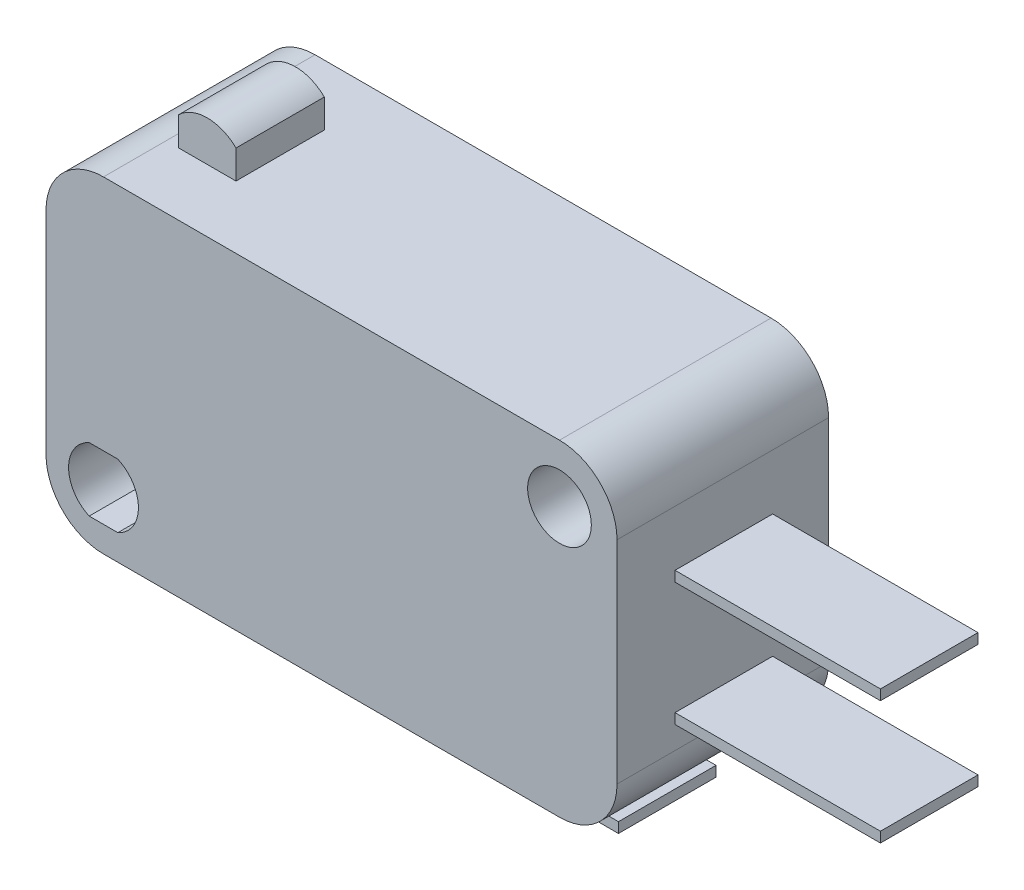
ISO-10303-21;
HEADER;
FILE_DESCRIPTION(('STEP AP214'),'2;1');
FILE_NAME('part.step','',(''),(''),'','','');
FILE_SCHEMA(('AUTOMOTIVE_DESIGN { 1 0 10303 214 1 1 1 1 }'));
ENDSEC;
DATA;
#1=APPLICATION_CONTEXT('core data for automotive mechanical design processes');
#2=APPLICATION_PROTOCOL_DEFINITION('international standard','automotive_design',2000,#1);
#3=PRODUCT_CONTEXT('',#1,'mechanical');
#4=PRODUCT('Part','Part','',(#3));
#5=PRODUCT_RELATED_PRODUCT_CATEGORY('part','',(#4));
#6=PRODUCT_DEFINITION_FORMATION('','',#4);
#7=PRODUCT_DEFINITION_CONTEXT('part definition',#1,'design');
#8=PRODUCT_DEFINITION('design','',#6,#7);
#9=PRODUCT_DEFINITION_SHAPE('','',#8);
#10=(LENGTH_UNIT() NAMED_UNIT(*) SI_UNIT(.MILLI.,.METRE.));
#11=(NAMED_UNIT(*) PLANE_ANGLE_UNIT() SI_UNIT($,.RADIAN.));
#12=(NAMED_UNIT(*) SI_UNIT($,.STERADIAN.) SOLID_ANGLE_UNIT());
#13=UNCERTAINTY_MEASURE_WITH_UNIT(LENGTH_MEASURE(1.E-05),#10,'distance_accuracy_value','');
#14=(GEOMETRIC_REPRESENTATION_CONTEXT(3) GLOBAL_UNCERTAINTY_ASSIGNED_CONTEXT((#13)) GLOBAL_UNIT_ASSIGNED_CONTEXT((#10,
#11,#12)) REPRESENTATION_CONTEXT('',''));
#15=CARTESIAN_POINT('',(0.,0.,0.));
#16=DIRECTION('',(0.,0.,1.));
#17=DIRECTION('',(1.,0.,0.));
#18=AXIS2_PLACEMENT_3D('',#15,#16,#17);
#19=CARTESIAN_POINT('',(-25.,2.8,5.15));
#20=DIRECTION('',(0.,-1.,0.));
#21=DIRECTION('',(0.,0.,-1.));
#22=AXIS2_PLACEMENT_3D('',#19,#20,#21);
#23=PLANE('',#22);
#24=DIRECTION('',(-1.,0.,0.));
#25=VECTOR('',#24,1.);
#26=CARTESIAN_POINT('',(-25.,2.8,-5.15));
#27=LINE('',#26,#25);
#28=CARTESIAN_POINT('',(0.,2.8,-5.15));
#29=VERTEX_POINT('',#28);
#30=CARTESIAN_POINT('',(-22.2,2.8,-5.15));
#31=VERTEX_POINT('',#30);
#32=EDGE_CURVE('E407',#29,#31,#27,.T.);
#33=ORIENTED_EDGE('',*,*,#32,.T.);
#34=DIRECTION('',(0.,0.,-1.));
#35=VECTOR('',#34,1.);
#36=CARTESIAN_POINT('',(-22.2,2.8,5.15));
#37=LINE('',#36,#35);
#38=CARTESIAN_POINT('',(-22.2,2.8,5.15));
#39=VERTEX_POINT('',#38);
#40=EDGE_CURVE('E437',#31,#39,#37,.F.);
#41=ORIENTED_EDGE('',*,*,#40,.T.);
#42=DIRECTION('',(-1.,0.,0.));
#43=VECTOR('',#42,1.);
#44=CARTESIAN_POINT('',(-25.,2.8,5.15));
#45=LINE('',#44,#43);
#46=CARTESIAN_POINT('',(0.,2.8,5.15));
#47=VERTEX_POINT('',#46);
#48=EDGE_CURVE('E418',#47,#39,#45,.T.);
#49=ORIENTED_EDGE('',*,*,#48,.F.);
#50=DIRECTION('',(0.,0.,-1.));
#51=VECTOR('',#50,1.);
#52=CARTESIAN_POINT('',(0.,2.8,5.15));
#53=LINE('',#52,#51);
#54=EDGE_CURVE('E434',#47,#29,#53,.T.);
#55=ORIENTED_EDGE('',*,*,#54,.T.);
#56=EDGE_LOOP('',(#33,#41,#49,#55));
#57=FACE_BOUND('',#56,.T.);
#58=DIRECTION('',(-1.,0.,0.));
#59=VECTOR('',#58,1.);
#60=CARTESIAN_POINT('',(-21.6,2.8,-2.2));
#61=LINE('',#60,#59);
#62=CARTESIAN_POINT('',(-18.8,2.8,-2.2));
#63=VERTEX_POINT('',#62);
#64=CARTESIAN_POINT('',(-21.6,2.8,-2.2));
#65=VERTEX_POINT('',#64);
#66=EDGE_CURVE('E245',#63,#65,#61,.T.);
#67=ORIENTED_EDGE('',*,*,#66,.F.);
#68=DIRECTION('',(0.,0.,1.));
#69=VECTOR('',#68,1.);
#70=CARTESIAN_POINT('',(-18.8,2.8,-2.2));
#71=LINE('',#70,#69);
#72=CARTESIAN_POINT('',(-18.8,2.8,2.1));
#73=VERTEX_POINT('',#72);
#74=EDGE_CURVE('E232',#63,#73,#71,.T.);
#75=ORIENTED_EDGE('',*,*,#74,.T.);
#76=DIRECTION('',(-1.,0.,0.));
#77=VECTOR('',#76,1.);
#78=CARTESIAN_POINT('',(-21.6,2.8,2.1));
#79=LINE('',#78,#77);
#80=CARTESIAN_POINT('',(-21.6,2.8,2.1));
#81=VERTEX_POINT('',#80);
#82=EDGE_CURVE('E219',#73,#81,#79,.T.);
#83=ORIENTED_EDGE('',*,*,#82,.T.);
#84=DIRECTION('',(0.,0.,1.));
#85=VECTOR('',#84,1.);
#86=CARTESIAN_POINT('',(-21.6,2.8,-2.2));
#87=LINE('',#86,#85);
#88=EDGE_CURVE('E250',#65,#81,#87,.T.);
#89=ORIENTED_EDGE('',*,*,#88,.F.);
#90=EDGE_LOOP('',(#67,#75,#83,#89));
#91=FACE_BOUND('',#90,.T.);
#92=ADVANCED_FACE('F17',(#57,#91),#23,.F.);
#93=CARTESIAN_POINT('',(-25.,-13.1,5.15));
#94=DIRECTION('',(0.,1.,0.));
#95=DIRECTION('',(-1.,0.,0.));
#96=AXIS2_PLACEMENT_3D('',#93,#94,#95);
#97=PLANE('',#96);
#98=DIRECTION('',(1.,0.,0.));
#99=VECTOR('',#98,1.);
#100=CARTESIAN_POINT('',(-25.,-13.1,5.15));
#101=LINE('',#100,#99);
#102=CARTESIAN_POINT('',(-22.2,-13.1,5.15));
#103=VERTEX_POINT('',#102);
#104=CARTESIAN_POINT('',(0.,-13.1,5.15));
#105=VERTEX_POINT('',#104);
#106=EDGE_CURVE('E413',#103,#105,#101,.T.);
#107=ORIENTED_EDGE('',*,*,#106,.F.);
#108=DIRECTION('',(0.,0.,-1.));
#109=VECTOR('',#108,1.);
#110=CARTESIAN_POINT('',(-22.2,-13.1,5.15));
#111=LINE('',#110,#109);
#112=CARTESIAN_POINT('',(-22.2,-13.1,-5.15));
#113=VERTEX_POINT('',#112);
#114=EDGE_CURVE('E449',#103,#113,#111,.T.);
#115=ORIENTED_EDGE('',*,*,#114,.T.);
#116=DIRECTION('',(1.,0.,0.));
#117=VECTOR('',#116,1.);
#118=CARTESIAN_POINT('',(-25.,-13.1,-5.15));
#119=LINE('',#118,#117);
#120=CARTESIAN_POINT('',(0.,-13.1,-5.15));
#121=VERTEX_POINT('',#120);
#122=EDGE_CURVE('E402',#113,#121,#119,.T.);
#123=ORIENTED_EDGE('',*,*,#122,.T.);
#124=DIRECTION('',(0.,0.,-1.));
#125=VECTOR('',#124,1.);
#126=CARTESIAN_POINT('',(0.,-13.1,5.15));
#127=LINE('',#126,#125);
#128=EDGE_CURVE('E447',#121,#105,#127,.F.);
#129=ORIENTED_EDGE('',*,*,#128,.T.);
#130=EDGE_LOOP('',(#107,#115,#123,#129));
#131=FACE_BOUND('',#130,.T.);
#132=DIRECTION('',(-1.,0.,0.));
#133=VECTOR('',#132,1.);
#134=CARTESIAN_POINT('',(-9.98,-13.1,1.5));
#135=LINE('',#134,#133);
#136=CARTESIAN_POINT('',(-9.48,-13.1,1.5));
#137=VERTEX_POINT('',#136);
#138=CARTESIAN_POINT('',(-9.98,-13.1,1.5));
#139=VERTEX_POINT('',#138);
#140=EDGE_CURVE('E303',#137,#139,#135,.T.);
#141=ORIENTED_EDGE('',*,*,#140,.F.);
#142=DIRECTION('',(0.,0.,-1.));
#143=VECTOR('',#142,1.);
#144=CARTESIAN_POINT('',(-9.48,-13.1,1.5));
#145=LINE('',#144,#143);
#146=CARTESIAN_POINT('',(-9.48,-13.1,-3.25));
#147=VERTEX_POINT('',#146);
#148=EDGE_CURVE('E316',#137,#147,#145,.T.);
#149=ORIENTED_EDGE('',*,*,#148,.T.);
#150=DIRECTION('',(-1.,0.,0.));
#151=VECTOR('',#150,1.);
#152=CARTESIAN_POINT('',(-9.98,-13.1,-3.25));
#153=LINE('',#152,#151);
#154=CARTESIAN_POINT('',(-9.98,-13.1,-3.25));
#155=VERTEX_POINT('',#154);
#156=EDGE_CURVE('E290',#147,#155,#153,.T.);
#157=ORIENTED_EDGE('',*,*,#156,.T.);
#158=DIRECTION('',(0.,0.,-1.));
#159=VECTOR('',#158,1.);
#160=CARTESIAN_POINT('',(-9.98,-13.1,1.5));
#161=LINE('',#160,#159);
#162=EDGE_CURVE('E331',#139,#155,#161,.T.);
#163=ORIENTED_EDGE('',*,*,#162,.F.);
#164=EDGE_LOOP('',(#141,#149,#157,#163));
#165=FACE_BOUND('',#164,.T.);
#166=ADVANCED_FACE('F455',(#131,#165),#97,.F.);
#167=CARTESIAN_POINT('',(2.8,2.8,5.15));
#168=DIRECTION('',(-1.,0.,0.));
#169=DIRECTION('',(0.,-1.,0.));
#170=AXIS2_PLACEMENT_3D('',#167,#168,#169);
#171=PLANE('',#170);
#172=DIRECTION('',(0.,-1.,0.));
#173=VECTOR('',#172,1.);
#174=CARTESIAN_POINT('',(2.8,-2.7,2.325));
#175=LINE('',#174,#173);
#176=CARTESIAN_POINT('',(2.8,-2.7,2.325));
#177=VERTEX_POINT('',#176);
#178=CARTESIAN_POINT('',(2.8,-3.2,2.325));
#179=VERTEX_POINT('',#178);
#180=EDGE_CURVE('E366',#177,#179,#175,.T.);
#181=ORIENTED_EDGE('',*,*,#180,.F.);
#182=DIRECTION('',(0.,0.,1.));
#183=VECTOR('',#182,1.);
#184=CARTESIAN_POINT('',(2.8,-2.7,2.325));
#185=LINE('',#184,#183);
#186=CARTESIAN_POINT('',(2.8,-2.7,-2.425));
#187=VERTEX_POINT('',#186);
#188=EDGE_CURVE('E375',#187,#177,#185,.T.);
#189=ORIENTED_EDGE('',*,*,#188,.F.);
#190=DIRECTION('',(0.,1.,0.));
#191=VECTOR('',#190,1.);
#192=CARTESIAN_POINT('',(2.8,-2.7,-2.425));
#193=LINE('',#192,#191);
#194=CARTESIAN_POINT('',(2.8,-3.2,-2.425));
#195=VERTEX_POINT('',#194);
#196=EDGE_CURVE('E372',#195,#187,#193,.T.);
#197=ORIENTED_EDGE('',*,*,#196,.F.);
#198=DIRECTION('',(0.,0.,-1.));
#199=VECTOR('',#198,1.);
#200=CARTESIAN_POINT('',(2.8,-3.2,2.325));
#201=LINE('',#200,#199);
#202=EDGE_CURVE('E369',#179,#195,#201,.T.);
#203=ORIENTED_EDGE('',*,*,#202,.F.);
#204=EDGE_LOOP('',(#181,#189,#197,#203));
#205=FACE_BOUND('',#204,.T.);
#206=DIRECTION('',(0.,1.,0.));
#207=VECTOR('',#206,1.);
#208=CARTESIAN_POINT('',(2.8,2.8,5.15));
#209=LINE('',#208,#207);
#210=CARTESIAN_POINT('',(2.8,-10.3,5.15));
#211=VERTEX_POINT('',#210);
#212=CARTESIAN_POINT('',(2.8,0.,5.15));
#213=VERTEX_POINT('',#212);
#214=EDGE_CURVE('E416',#211,#213,#209,.T.);
#215=ORIENTED_EDGE('',*,*,#214,.F.);
#216=DIRECTION('',(0.,0.,-1.));
#217=VECTOR('',#216,1.);
#218=CARTESIAN_POINT('',(2.8,-10.3,5.15));
#219=LINE('',#218,#217);
#220=CARTESIAN_POINT('',(2.8,-10.3,-5.15));
#221=VERTEX_POINT('',#220);
#222=EDGE_CURVE('E11',#211,#221,#219,.T.);
#223=ORIENTED_EDGE('',*,*,#222,.T.);
#224=DIRECTION('',(0.,1.,0.));
#225=VECTOR('',#224,1.);
#226=CARTESIAN_POINT('',(2.8,2.8,-5.15));
#227=LINE('',#226,#225);
#228=CARTESIAN_POINT('',(2.8,0.,-5.15));
#229=VERTEX_POINT('',#228);
#230=EDGE_CURVE('E405',#221,#229,#227,.T.);
#231=ORIENTED_EDGE('',*,*,#230,.T.);
#232=DIRECTION('',(0.,0.,-1.));
#233=VECTOR('',#232,1.);
#234=CARTESIAN_POINT('',(2.8,0.,5.15));
#235=LINE('',#234,#233);
#236=EDGE_CURVE('E25',#229,#213,#235,.F.);
#237=ORIENTED_EDGE('',*,*,#236,.T.);
#238=EDGE_LOOP('',(#215,#223,#231,#237));
#239=FACE_BOUND('',#238,.T.);
#240=DIRECTION('',(0.,-1.,0.));
#241=VECTOR('',#240,1.);
#242=CARTESIAN_POINT('',(2.8,-8.7,2.325));
#243=LINE('',#242,#241);
#244=CARTESIAN_POINT('',(2.8,-8.7,2.325));
#245=VERTEX_POINT('',#244);
#246=CARTESIAN_POINT('',(2.8,-9.2,2.325));
#247=VERTEX_POINT('',#246);
#248=EDGE_CURVE('E333',#245,#247,#243,.T.);
#249=ORIENTED_EDGE('',*,*,#248,.F.);
#250=DIRECTION('',(0.,0.,1.));
#251=VECTOR('',#250,1.);
#252=CARTESIAN_POINT('',(2.8,-8.7,2.325));
#253=LINE('',#252,#251);
#254=CARTESIAN_POINT('',(2.8,-8.7,-2.425));
#255=VERTEX_POINT('',#254);
#256=EDGE_CURVE('E342',#255,#245,#253,.T.);
#257=ORIENTED_EDGE('',*,*,#256,.F.);
#258=DIRECTION('',(0.,1.,0.));
#259=VECTOR('',#258,1.);
#260=CARTESIAN_POINT('',(2.8,-8.7,-2.425));
#261=LINE('',#260,#259);
#262=CARTESIAN_POINT('',(2.8,-9.2,-2.425));
#263=VERTEX_POINT('',#262);
#264=EDGE_CURVE('E339',#263,#255,#261,.T.);
#265=ORIENTED_EDGE('',*,*,#264,.F.);
#266=DIRECTION('',(0.,0.,-1.));
#267=VECTOR('',#266,1.);
#268=CARTESIAN_POINT('',(2.8,-9.2,2.325));
#269=LINE('',#268,#267);
#270=EDGE_CURVE('E336',#247,#263,#269,.T.);
#271=ORIENTED_EDGE('',*,*,#270,.F.);
#272=EDGE_LOOP('',(#249,#257,#265,#271));
#273=FACE_BOUND('',#272,.T.);
#274=ADVANCED_FACE('F468',(#205,#239,#273),#171,.F.);
#275=CARTESIAN_POINT('',(-25.,2.8,5.15));
#276=DIRECTION('',(1.,0.,0.));
#277=DIRECTION('',(0.,1.,0.));
#278=AXIS2_PLACEMENT_3D('',#275,#276,#277);
#279=PLANE('',#278);
#280=DIRECTION('',(0.,-1.,0.));
#281=VECTOR('',#280,1.);
#282=CARTESIAN_POINT('',(-25.,2.8,5.15));
#283=LINE('',#282,#281);
#284=CARTESIAN_POINT('',(-25.,0.,5.15));
#285=VERTEX_POINT('',#284);
#286=CARTESIAN_POINT('',(-25.,-10.3,5.15));
#287=VERTEX_POINT('',#286);
#288=EDGE_CURVE('E410',#285,#287,#283,.T.);
#289=ORIENTED_EDGE('',*,*,#288,.F.);
#290=DIRECTION('',(0.,0.,-1.));
#291=VECTOR('',#290,1.);
#292=CARTESIAN_POINT('',(-25.,0.,5.15));
#293=LINE('',#292,#291);
#294=CARTESIAN_POINT('',(-25.,0.,-5.15));
#295=VERTEX_POINT('',#294);
#296=EDGE_CURVE('E423',#285,#295,#293,.T.);
#297=ORIENTED_EDGE('',*,*,#296,.T.);
#298=DIRECTION('',(0.,-1.,0.));
#299=VECTOR('',#298,1.);
#300=CARTESIAN_POINT('',(-25.,2.8,-5.15));
#301=LINE('',#300,#299);
#302=CARTESIAN_POINT('',(-25.,-10.3,-5.15));
#303=VERTEX_POINT('',#302);
#304=EDGE_CURVE('E399',#295,#303,#301,.T.);
#305=ORIENTED_EDGE('',*,*,#304,.T.);
#306=DIRECTION('',(0.,0.,-1.));
#307=VECTOR('',#306,1.);
#308=CARTESIAN_POINT('',(-25.,-10.3,5.15));
#309=LINE('',#308,#307);
#310=EDGE_CURVE('E421',#303,#287,#309,.F.);
#311=ORIENTED_EDGE('',*,*,#310,.T.);
#312=EDGE_LOOP('',(#289,#297,#305,#311));
#313=FACE_BOUND('',#312,.T.);
#314=ADVANCED_FACE('F19',(#313),#279,.F.);
#315=CARTESIAN_POINT('',(-25.,2.8,5.15));
#316=DIRECTION('',(0.,0.,1.));
#317=DIRECTION('',(1.,0.,0.));
#318=AXIS2_PLACEMENT_3D('',#315,#316,#317);
#319=PLANE('',#318);
#320=CARTESIAN_POINT('',(-22.2,-10.3,5.15));
#321=DIRECTION('',(0.,0.,1.));
#322=DIRECTION('',(1.,0.,0.));
#323=AXIS2_PLACEMENT_3D('',#320,#321,#322);
#324=CIRCLE('',#323,1.7);
#325=CARTESIAN_POINT('',(-22.8982120021885,-8.75,5.15));
#326=VERTEX_POINT('',#325);
#327=CARTESIAN_POINT('',(-22.8982120021884,-11.85,5.15));
#328=VERTEX_POINT('',#327);
#329=EDGE_CURVE('E231',#326,#328,#324,.T.);
#330=ORIENTED_EDGE('',*,*,#329,.F.);
#331=DIRECTION('',(-1.,0.,0.));
#332=VECTOR('',#331,1.);
#333=CARTESIAN_POINT('',(-22.8982120021885,-8.75,5.15));
#334=LINE('',#333,#332);
#335=CARTESIAN_POINT('',(-21.5017879978115,-8.75,5.15));
#336=VERTEX_POINT('',#335);
#337=EDGE_CURVE('E260',#336,#326,#334,.T.);
#338=ORIENTED_EDGE('',*,*,#337,.F.);
#339=CARTESIAN_POINT('',(-22.2,-10.3,5.15));
#340=DIRECTION('',(0.,0.,1.));
#341=DIRECTION('',(1.,0.,0.));
#342=AXIS2_PLACEMENT_3D('',#339,#340,#341);
#343=CIRCLE('',#342,1.7);
#344=CARTESIAN_POINT('',(-21.5017879978116,-11.85,5.15));
#345=VERTEX_POINT('',#344);
#346=EDGE_CURVE('E257',#345,#336,#343,.T.);
#347=ORIENTED_EDGE('',*,*,#346,.F.);
#348=DIRECTION('',(1.,0.,0.));
#349=VECTOR('',#348,1.);
#350=CARTESIAN_POINT('',(-22.8982120021884,-11.85,5.15));
#351=LINE('',#350,#349);
#352=EDGE_CURVE('E254',#328,#345,#351,.T.);
#353=ORIENTED_EDGE('',*,*,#352,.F.);
#354=EDGE_LOOP('',(#330,#338,#347,#353));
#355=FACE_BOUND('',#354,.T.);
#356=CARTESIAN_POINT('',(0.,0.,5.15));
#357=DIRECTION('',(0.,0.,1.));
#358=DIRECTION('',(1.,0.,0.));
#359=AXIS2_PLACEMENT_3D('',#356,#357,#358);
#360=CIRCLE('',#359,1.55);
#361=CARTESIAN_POINT('',(1.55,0.,5.15));
#362=VERTEX_POINT('',#361);
#363=EDGE_CURVE('E278',#362,#362,#360,.T.);
#364=ORIENTED_EDGE('',*,*,#363,.F.);
#365=EDGE_LOOP('',(#364));
#366=FACE_BOUND('',#365,.T.);
#367=ORIENTED_EDGE('',*,*,#48,.T.);
#368=CARTESIAN_POINT('',(-22.2,0.,5.15));
#369=DIRECTION('',(0.,0.,1.));
#370=DIRECTION('',(1.,0.,0.));
#371=AXIS2_PLACEMENT_3D('',#368,#369,#370);
#372=CIRCLE('',#371,2.8);
#373=EDGE_CURVE('E445',#39,#285,#372,.T.);
#374=ORIENTED_EDGE('',*,*,#373,.T.);
#375=ORIENTED_EDGE('',*,*,#288,.T.);
#376=CARTESIAN_POINT('',(-22.2,-10.3,5.15));
#377=DIRECTION('',(0.,0.,1.));
#378=DIRECTION('',(1.,0.,0.));
#379=AXIS2_PLACEMENT_3D('',#376,#377,#378);
#380=CIRCLE('',#379,2.8);
#381=EDGE_CURVE('E443',#287,#103,#380,.T.);
#382=ORIENTED_EDGE('',*,*,#381,.T.);
#383=ORIENTED_EDGE('',*,*,#106,.T.);
#384=CARTESIAN_POINT('',(0.,-10.3,5.15));
#385=DIRECTION('',(0.,0.,1.));
#386=DIRECTION('',(1.,0.,0.));
#387=AXIS2_PLACEMENT_3D('',#384,#385,#386);
#388=CIRCLE('',#387,2.8);
#389=EDGE_CURVE('E441',#105,#211,#388,.T.);
#390=ORIENTED_EDGE('',*,*,#389,.T.);
#391=ORIENTED_EDGE('',*,*,#214,.T.);
#392=CARTESIAN_POINT('',(0.,0.,5.15));
#393=DIRECTION('',(0.,0.,1.));
#394=DIRECTION('',(1.,0.,0.));
#395=AXIS2_PLACEMENT_3D('',#392,#393,#394);
#396=CIRCLE('',#395,2.8);
#397=EDGE_CURVE('E439',#213,#47,#396,.T.);
#398=ORIENTED_EDGE('',*,*,#397,.T.);
#399=EDGE_LOOP('',(#367,#374,#375,#382,#383,#390,#391,#398));
#400=FACE_BOUND('',#399,.T.);
#401=ADVANCED_FACE('F472',(#355,#366,#400),#319,.T.);
#402=CARTESIAN_POINT('',(-25.,2.8,-5.15));
#403=DIRECTION('',(0.,0.,1.));
#404=DIRECTION('',(1.,0.,0.));
#405=AXIS2_PLACEMENT_3D('',#402,#403,#404);
#406=PLANE('',#405);
#407=DIRECTION('',(-1.,0.,0.));
#408=VECTOR('',#407,1.);
#409=CARTESIAN_POINT('',(-22.8982120021885,-8.75,-5.15));
#410=LINE('',#409,#408);
#411=CARTESIAN_POINT('',(-21.5017879978115,-8.75,-5.15));
#412=VERTEX_POINT('',#411);
#413=CARTESIAN_POINT('',(-22.8982120021885,-8.75,-5.15));
#414=VERTEX_POINT('',#413);
#415=EDGE_CURVE('E272',#412,#414,#410,.T.);
#416=ORIENTED_EDGE('',*,*,#415,.T.);
#417=CARTESIAN_POINT('',(-22.2,-10.3,-5.15));
#418=DIRECTION('',(0.,0.,1.));
#419=DIRECTION('',(1.,0.,0.));
#420=AXIS2_PLACEMENT_3D('',#417,#418,#419);
#421=CIRCLE('',#420,1.7);
#422=CARTESIAN_POINT('',(-22.8982120021884,-11.85,-5.15));
#423=VERTEX_POINT('',#422);
#424=EDGE_CURVE('E263',#414,#423,#421,.T.);
#425=ORIENTED_EDGE('',*,*,#424,.T.);
#426=DIRECTION('',(1.,0.,0.));
#427=VECTOR('',#426,1.);
#428=CARTESIAN_POINT('',(-22.8982120021884,-11.85,-5.15));
#429=LINE('',#428,#427);
#430=CARTESIAN_POINT('',(-21.5017879978116,-11.85,-5.15));
#431=VERTEX_POINT('',#430);
#432=EDGE_CURVE('E266',#423,#431,#429,.T.);
#433=ORIENTED_EDGE('',*,*,#432,.T.);
#434=CARTESIAN_POINT('',(-22.2,-10.3,-5.15));
#435=DIRECTION('',(0.,0.,1.));
#436=DIRECTION('',(1.,0.,0.));
#437=AXIS2_PLACEMENT_3D('',#434,#435,#436);
#438=CIRCLE('',#437,1.7);
#439=EDGE_CURVE('E269',#431,#412,#438,.T.);
#440=ORIENTED_EDGE('',*,*,#439,.T.);
#441=EDGE_LOOP('',(#416,#425,#433,#440));
#442=FACE_BOUND('',#441,.T.);
#443=CARTESIAN_POINT('',(0.,0.,-5.15));
#444=DIRECTION('',(0.,0.,1.));
#445=DIRECTION('',(1.,0.,0.));
#446=AXIS2_PLACEMENT_3D('',#443,#444,#445);
#447=CIRCLE('',#446,1.55);
#448=CARTESIAN_POINT('',(1.55,0.,-5.15));
#449=VERTEX_POINT('',#448);
#450=EDGE_CURVE('E287',#449,#449,#447,.T.);
#451=ORIENTED_EDGE('',*,*,#450,.T.);
#452=EDGE_LOOP('',(#451));
#453=FACE_BOUND('',#452,.T.);
#454=ORIENTED_EDGE('',*,*,#304,.F.);
#455=CARTESIAN_POINT('',(-22.2,0.,-5.15));
#456=DIRECTION('',(0.,0.,1.));
#457=DIRECTION('',(1.,0.,0.));
#458=AXIS2_PLACEMENT_3D('',#455,#456,#457);
#459=CIRCLE('',#458,2.8);
#460=EDGE_CURVE('E432',#295,#31,#459,.F.);
#461=ORIENTED_EDGE('',*,*,#460,.T.);
#462=ORIENTED_EDGE('',*,*,#32,.F.);
#463=CARTESIAN_POINT('',(0.,0.,-5.15));
#464=DIRECTION('',(0.,0.,1.));
#465=DIRECTION('',(1.,0.,0.));
#466=AXIS2_PLACEMENT_3D('',#463,#464,#465);
#467=CIRCLE('',#466,2.8);
#468=EDGE_CURVE('E426',#29,#229,#467,.F.);
#469=ORIENTED_EDGE('',*,*,#468,.T.);
#470=ORIENTED_EDGE('',*,*,#230,.F.);
#471=CARTESIAN_POINT('',(0.,-10.3,-5.15));
#472=DIRECTION('',(0.,0.,1.));
#473=DIRECTION('',(1.,0.,0.));
#474=AXIS2_PLACEMENT_3D('',#471,#472,#473);
#475=CIRCLE('',#474,2.8);
#476=EDGE_CURVE('E428',#221,#121,#475,.F.);
#477=ORIENTED_EDGE('',*,*,#476,.T.);
#478=ORIENTED_EDGE('',*,*,#122,.F.);
#479=CARTESIAN_POINT('',(-22.2,-10.3,-5.15));
#480=DIRECTION('',(0.,0.,1.));
#481=DIRECTION('',(1.,0.,0.));
#482=AXIS2_PLACEMENT_3D('',#479,#480,#481);
#483=CIRCLE('',#482,2.8);
#484=EDGE_CURVE('E430',#113,#303,#483,.F.);
#485=ORIENTED_EDGE('',*,*,#484,.T.);
#486=EDGE_LOOP('',(#454,#461,#462,#469,#470,#477,#478,#485));
#487=FACE_BOUND('',#486,.T.);
#488=ADVANCED_FACE('F462',(#442,#453,#487),#406,.F.);
#489=CARTESIAN_POINT('',(12.8,-2.7,2.325));
#490=DIRECTION('',(0.,0.,-1.));
#491=DIRECTION('',(0.,1.,0.));
#492=AXIS2_PLACEMENT_3D('',#489,#490,#491);
#493=PLANE('',#492);
#494=ORIENTED_EDGE('',*,*,#180,.T.);
#495=DIRECTION('',(-1.,0.,0.));
#496=VECTOR('',#495,1.);
#497=CARTESIAN_POINT('',(12.8,-3.2,2.325));
#498=LINE('',#497,#496);
#499=CARTESIAN_POINT('',(12.8,-3.2,2.325));
#500=VERTEX_POINT('',#499);
#501=EDGE_CURVE('E396',#500,#179,#498,.T.);
#502=ORIENTED_EDGE('',*,*,#501,.F.);
#503=DIRECTION('',(0.,-1.,0.));
#504=VECTOR('',#503,1.);
#505=CARTESIAN_POINT('',(12.8,-2.7,2.325));
#506=LINE('',#505,#504);
#507=CARTESIAN_POINT('',(12.8,-2.7,2.325));
#508=VERTEX_POINT('',#507);
#509=EDGE_CURVE('E378',#508,#500,#506,.T.);
#510=ORIENTED_EDGE('',*,*,#509,.F.);
#511=DIRECTION('',(-1.,0.,0.));
#512=VECTOR('',#511,1.);
#513=CARTESIAN_POINT('',(12.8,-2.7,2.325));
#514=LINE('',#513,#512);
#515=EDGE_CURVE('E387',#508,#177,#514,.T.);
#516=ORIENTED_EDGE('',*,*,#515,.T.);
#517=EDGE_LOOP('',(#494,#502,#510,#516));
#518=FACE_BOUND('',#517,.T.);
#519=ADVANCED_FACE('F520',(#518),#493,.F.);
#520=CARTESIAN_POINT('',(12.8,-3.2,2.325));
#521=DIRECTION('',(0.,1.,0.));
#522=DIRECTION('',(-1.,0.,0.));
#523=AXIS2_PLACEMENT_3D('',#520,#521,#522);
#524=PLANE('',#523);
#525=ORIENTED_EDGE('',*,*,#202,.T.);
#526=DIRECTION('',(-1.,0.,0.));
#527=VECTOR('',#526,1.);
#528=CARTESIAN_POINT('',(12.8,-3.2,-2.425));
#529=LINE('',#528,#527);
#530=CARTESIAN_POINT('',(12.8,-3.2,-2.425));
#531=VERTEX_POINT('',#530);
#532=EDGE_CURVE('E393',#531,#195,#529,.T.);
#533=ORIENTED_EDGE('',*,*,#532,.F.);
#534=DIRECTION('',(0.,0.,-1.));
#535=VECTOR('',#534,1.);
#536=CARTESIAN_POINT('',(12.8,-3.2,2.325));
#537=LINE('',#536,#535);
#538=EDGE_CURVE('E381',#500,#531,#537,.T.);
#539=ORIENTED_EDGE('',*,*,#538,.F.);
#540=ORIENTED_EDGE('',*,*,#501,.T.);
#541=EDGE_LOOP('',(#525,#533,#539,#540));
#542=FACE_BOUND('',#541,.T.);
#543=ADVANCED_FACE('F528',(#542),#524,.F.);
#544=CARTESIAN_POINT('',(12.8,-2.7,-2.425));
#545=DIRECTION('',(0.,0.,1.));
#546=DIRECTION('',(0.,-1.,0.));
#547=AXIS2_PLACEMENT_3D('',#544,#545,#546);
#548=PLANE('',#547);
#549=ORIENTED_EDGE('',*,*,#196,.T.);
#550=DIRECTION('',(-1.,0.,0.));
#551=VECTOR('',#550,1.);
#552=CARTESIAN_POINT('',(12.8,-2.7,-2.425));
#553=LINE('',#552,#551);
#554=CARTESIAN_POINT('',(12.8,-2.7,-2.425));
#555=VERTEX_POINT('',#554);
#556=EDGE_CURVE('E390',#555,#187,#553,.T.);
#557=ORIENTED_EDGE('',*,*,#556,.F.);
#558=DIRECTION('',(0.,1.,0.));
#559=VECTOR('',#558,1.);
#560=CARTESIAN_POINT('',(12.8,-2.7,-2.425));
#561=LINE('',#560,#559);
#562=EDGE_CURVE('E383',#531,#555,#561,.T.);
#563=ORIENTED_EDGE('',*,*,#562,.F.);
#564=ORIENTED_EDGE('',*,*,#532,.T.);
#565=EDGE_LOOP('',(#549,#557,#563,#564));
#566=FACE_BOUND('',#565,.T.);
#567=ADVANCED_FACE('F526',(#566),#548,.F.);
#568=CARTESIAN_POINT('',(12.8,-2.7,2.325));
#569=DIRECTION('',(0.,-1.,0.));
#570=DIRECTION('',(1.,0.,0.));
#571=AXIS2_PLACEMENT_3D('',#568,#569,#570);
#572=PLANE('',#571);
#573=ORIENTED_EDGE('',*,*,#188,.T.);
#574=ORIENTED_EDGE('',*,*,#515,.F.);
#575=DIRECTION('',(0.,0.,1.));
#576=VECTOR('',#575,1.);
#577=CARTESIAN_POINT('',(12.8,-2.7,2.325));
#578=LINE('',#577,#576);
#579=EDGE_CURVE('E385',#555,#508,#578,.T.);
#580=ORIENTED_EDGE('',*,*,#579,.F.);
#581=ORIENTED_EDGE('',*,*,#556,.T.);
#582=EDGE_LOOP('',(#573,#574,#580,#581));
#583=FACE_BOUND('',#582,.T.);
#584=ADVANCED_FACE('F516',(#583),#572,.F.);
#585=CARTESIAN_POINT('',(12.8,-3.2,2.325));
#586=DIRECTION('',(1.,0.,0.));
#587=DIRECTION('',(0.,0.,-1.));
#588=AXIS2_PLACEMENT_3D('',#585,#586,#587);
#589=PLANE('',#588);
#590=ORIENTED_EDGE('',*,*,#509,.T.);
#591=ORIENTED_EDGE('',*,*,#538,.T.);
#592=ORIENTED_EDGE('',*,*,#562,.T.);
#593=ORIENTED_EDGE('',*,*,#579,.T.);
#594=EDGE_LOOP('',(#590,#591,#592,#593));
#595=FACE_BOUND('',#594,.T.);
#596=ADVANCED_FACE('F522',(#595),#589,.T.);
#597=CARTESIAN_POINT('',(12.8,-8.7,2.325));
#598=DIRECTION('',(0.,0.,-1.));
#599=DIRECTION('',(0.,1.,0.));
#600=AXIS2_PLACEMENT_3D('',#597,#598,#599);
#601=PLANE('',#600);
#602=ORIENTED_EDGE('',*,*,#248,.T.);
#603=DIRECTION('',(-1.,0.,0.));
#604=VECTOR('',#603,1.);
#605=CARTESIAN_POINT('',(12.8,-9.2,2.325));
#606=LINE('',#605,#604);
#607=CARTESIAN_POINT('',(12.8,-9.2,2.325));
#608=VERTEX_POINT('',#607);
#609=EDGE_CURVE('E363',#608,#247,#606,.T.);
#610=ORIENTED_EDGE('',*,*,#609,.F.);
#611=DIRECTION('',(0.,-1.,0.));
#612=VECTOR('',#611,1.);
#613=CARTESIAN_POINT('',(12.8,-8.7,2.325));
#614=LINE('',#613,#612);
#615=CARTESIAN_POINT('',(12.8,-8.7,2.325));
#616=VERTEX_POINT('',#615);
#617=EDGE_CURVE('E345',#616,#608,#614,.T.);
#618=ORIENTED_EDGE('',*,*,#617,.F.);
#619=DIRECTION('',(-1.,0.,0.));
#620=VECTOR('',#619,1.);
#621=CARTESIAN_POINT('',(12.8,-8.7,2.325));
#622=LINE('',#621,#620);
#623=EDGE_CURVE('E354',#616,#245,#622,.T.);
#624=ORIENTED_EDGE('',*,*,#623,.T.);
#625=EDGE_LOOP('',(#602,#610,#618,#624));
#626=FACE_BOUND('',#625,.T.);
#627=ADVANCED_FACE('F606',(#626),#601,.F.);
#628=CARTESIAN_POINT('',(12.8,-9.2,2.325));
#629=DIRECTION('',(0.,1.,0.));
#630=DIRECTION('',(-1.,0.,0.));
#631=AXIS2_PLACEMENT_3D('',#628,#629,#630);
#632=PLANE('',#631);
#633=ORIENTED_EDGE('',*,*,#270,.T.);
#634=DIRECTION('',(-1.,0.,0.));
#635=VECTOR('',#634,1.);
#636=CARTESIAN_POINT('',(12.8,-9.2,-2.425));
#637=LINE('',#636,#635);
#638=CARTESIAN_POINT('',(12.8,-9.2,-2.425));
#639=VERTEX_POINT('',#638);
#640=EDGE_CURVE('E360',#639,#263,#637,.T.);
#641=ORIENTED_EDGE('',*,*,#640,.F.);
#642=DIRECTION('',(0.,0.,-1.));
#643=VECTOR('',#642,1.);
#644=CARTESIAN_POINT('',(12.8,-9.2,2.325));
#645=LINE('',#644,#643);
#646=EDGE_CURVE('E348',#608,#639,#645,.T.);
#647=ORIENTED_EDGE('',*,*,#646,.F.);
#648=ORIENTED_EDGE('',*,*,#609,.T.);
#649=EDGE_LOOP('',(#633,#641,#647,#648));
#650=FACE_BOUND('',#649,.T.);
#651=ADVANCED_FACE('F602',(#650),#632,.F.);
#652=CARTESIAN_POINT('',(12.8,-8.7,-2.425));
#653=DIRECTION('',(0.,0.,1.));
#654=DIRECTION('',(1.,0.,0.));
#655=AXIS2_PLACEMENT_3D('',#652,#653,#654);
#656=PLANE('',#655);
#657=ORIENTED_EDGE('',*,*,#264,.T.);
#658=DIRECTION('',(-1.,0.,0.));
#659=VECTOR('',#658,1.);
#660=CARTESIAN_POINT('',(12.8,-8.7,-2.425));
#661=LINE('',#660,#659);
#662=CARTESIAN_POINT('',(12.8,-8.7,-2.425));
#663=VERTEX_POINT('',#662);
#664=EDGE_CURVE('E357',#663,#255,#661,.T.);
#665=ORIENTED_EDGE('',*,*,#664,.F.);
#666=DIRECTION('',(0.,1.,0.));
#667=VECTOR('',#666,1.);
#668=CARTESIAN_POINT('',(12.8,-8.7,-2.425));
#669=LINE('',#668,#667);
#670=EDGE_CURVE('E350',#639,#663,#669,.T.);
#671=ORIENTED_EDGE('',*,*,#670,.F.);
#672=ORIENTED_EDGE('',*,*,#640,.T.);
#673=EDGE_LOOP('',(#657,#665,#671,#672));
#674=FACE_BOUND('',#673,.T.);
#675=ADVANCED_FACE('F598',(#674),#656,.F.);
#676=CARTESIAN_POINT('',(12.8,-8.7,2.325));
#677=DIRECTION('',(0.,-1.,0.));
#678=DIRECTION('',(1.,0.,0.));
#679=AXIS2_PLACEMENT_3D('',#676,#677,#678);
#680=PLANE('',#679);
#681=ORIENTED_EDGE('',*,*,#256,.T.);
#682=ORIENTED_EDGE('',*,*,#623,.F.);
#683=DIRECTION('',(0.,0.,1.));
#684=VECTOR('',#683,1.);
#685=CARTESIAN_POINT('',(12.8,-8.7,2.325));
#686=LINE('',#685,#684);
#687=EDGE_CURVE('E352',#663,#616,#686,.T.);
#688=ORIENTED_EDGE('',*,*,#687,.F.);
#689=ORIENTED_EDGE('',*,*,#664,.T.);
#690=EDGE_LOOP('',(#681,#682,#688,#689));
#691=FACE_BOUND('',#690,.T.);
#692=ADVANCED_FACE('F594',(#691),#680,.F.);
#693=CARTESIAN_POINT('',(12.8,-9.2,2.325));
#694=DIRECTION('',(1.,0.,0.));
#695=DIRECTION('',(0.,0.,-1.));
#696=AXIS2_PLACEMENT_3D('',#693,#694,#695);
#697=PLANE('',#696);
#698=ORIENTED_EDGE('',*,*,#617,.T.);
#699=ORIENTED_EDGE('',*,*,#646,.T.);
#700=ORIENTED_EDGE('',*,*,#670,.T.);
#701=ORIENTED_EDGE('',*,*,#687,.T.);
#702=EDGE_LOOP('',(#698,#699,#700,#701));
#703=FACE_BOUND('',#702,.T.);
#704=ADVANCED_FACE('F590',(#703),#697,.T.);
#705=CARTESIAN_POINT('',(-9.98,-16.,1.5));
#706=DIRECTION('',(1.,0.,0.));
#707=DIRECTION('',(0.,0.,-1.));
#708=AXIS2_PLACEMENT_3D('',#705,#706,#707);
#709=PLANE('',#708);
#710=DIRECTION('',(0.,-1.,0.));
#711=VECTOR('',#710,1.);
#712=CARTESIAN_POINT('',(-9.98,-16.,-3.25));
#713=LINE('',#712,#711);
#714=CARTESIAN_POINT('',(-9.98,-16.,-3.25));
#715=VERTEX_POINT('',#714);
#716=EDGE_CURVE('E293',#155,#715,#713,.T.);
#717=ORIENTED_EDGE('',*,*,#716,.T.);
#718=DIRECTION('',(0.,0.,-1.));
#719=VECTOR('',#718,1.);
#720=CARTESIAN_POINT('',(-9.98,-16.,1.5));
#721=LINE('',#720,#719);
#722=CARTESIAN_POINT('',(-9.98,-16.,1.5));
#723=VERTEX_POINT('',#722);
#724=EDGE_CURVE('E328',#723,#715,#721,.T.);
#725=ORIENTED_EDGE('',*,*,#724,.F.);
#726=DIRECTION('',(0.,-1.,0.));
#727=VECTOR('',#726,1.);
#728=CARTESIAN_POINT('',(-9.98,-16.,1.5));
#729=LINE('',#728,#727);
#730=EDGE_CURVE('E306',#139,#723,#729,.T.);
#731=ORIENTED_EDGE('',*,*,#730,.F.);
#732=ORIENTED_EDGE('',*,*,#162,.T.);
#733=EDGE_LOOP('',(#717,#725,#731,#732));
#734=FACE_BOUND('',#733,.T.);
#735=ADVANCED_FACE('F586',(#734),#709,.F.);
#736=CARTESIAN_POINT('',(-0.78,-16.,1.5));
#737=DIRECTION('',(0.,1.,0.));
#738=DIRECTION('',(0.,0.,1.));
#739=AXIS2_PLACEMENT_3D('',#736,#737,#738);
#740=PLANE('',#739);
#741=DIRECTION('',(1.,0.,0.));
#742=VECTOR('',#741,1.);
#743=CARTESIAN_POINT('',(-0.78,-16.,-3.25));
#744=LINE('',#743,#742);
#745=CARTESIAN_POINT('',(-0.78,-16.,-3.25));
#746=VERTEX_POINT('',#745);
#747=EDGE_CURVE('E295',#715,#746,#744,.T.);
#748=ORIENTED_EDGE('',*,*,#747,.T.);
#749=DIRECTION('',(0.,0.,-1.));
#750=VECTOR('',#749,1.);
#751=CARTESIAN_POINT('',(-0.78,-16.,1.5));
#752=LINE('',#751,#750);
#753=CARTESIAN_POINT('',(-0.78,-16.,1.5));
#754=VERTEX_POINT('',#753);
#755=EDGE_CURVE('E325',#754,#746,#752,.T.);
#756=ORIENTED_EDGE('',*,*,#755,.F.);
#757=DIRECTION('',(1.,0.,0.));
#758=VECTOR('',#757,1.);
#759=CARTESIAN_POINT('',(-0.78,-16.,1.5));
#760=LINE('',#759,#758);
#761=EDGE_CURVE('E308',#723,#754,#760,.T.);
#762=ORIENTED_EDGE('',*,*,#761,.F.);
#763=ORIENTED_EDGE('',*,*,#724,.T.);
#764=EDGE_LOOP('',(#748,#756,#762,#763));
#765=FACE_BOUND('',#764,.T.);
#766=ADVANCED_FACE('F582',(#765),#740,.F.);
#767=CARTESIAN_POINT('',(-0.78,-15.5,1.5));
#768=DIRECTION('',(-1.,0.,0.));
#769=DIRECTION('',(0.,0.,1.));
#770=AXIS2_PLACEMENT_3D('',#767,#768,#769);
#771=PLANE('',#770);
#772=DIRECTION('',(0.,1.,0.));
#773=VECTOR('',#772,1.);
#774=CARTESIAN_POINT('',(-0.78,-15.5,-3.25));
#775=LINE('',#774,#773);
#776=CARTESIAN_POINT('',(-0.78,-15.5,-3.25));
#777=VERTEX_POINT('',#776);
#778=EDGE_CURVE('E297',#746,#777,#775,.T.);
#779=ORIENTED_EDGE('',*,*,#778,.T.);
#780=DIRECTION('',(0.,0.,-1.));
#781=VECTOR('',#780,1.);
#782=CARTESIAN_POINT('',(-0.78,-15.5,1.5));
#783=LINE('',#782,#781);
#784=CARTESIAN_POINT('',(-0.78,-15.5,1.5));
#785=VERTEX_POINT('',#784);
#786=EDGE_CURVE('E322',#785,#777,#783,.T.);
#787=ORIENTED_EDGE('',*,*,#786,.F.);
#788=DIRECTION('',(0.,1.,0.));
#789=VECTOR('',#788,1.);
#790=CARTESIAN_POINT('',(-0.78,-15.5,1.5));
#791=LINE('',#790,#789);
#792=EDGE_CURVE('E310',#754,#785,#791,.T.);
#793=ORIENTED_EDGE('',*,*,#792,.F.);
#794=ORIENTED_EDGE('',*,*,#755,.T.);
#795=EDGE_LOOP('',(#779,#787,#793,#794));
#796=FACE_BOUND('',#795,.T.);
#797=ADVANCED_FACE('F578',(#796),#771,.F.);
#798=CARTESIAN_POINT('',(-9.48,-15.5,1.5));
#799=DIRECTION('',(0.,-1.,0.));
#800=DIRECTION('',(0.,0.,-1.));
#801=AXIS2_PLACEMENT_3D('',#798,#799,#800);
#802=PLANE('',#801);
#803=DIRECTION('',(-1.,0.,0.));
#804=VECTOR('',#803,1.);
#805=CARTESIAN_POINT('',(-9.48,-15.5,-3.25));
#806=LINE('',#805,#804);
#807=CARTESIAN_POINT('',(-9.48,-15.5,-3.25));
#808=VERTEX_POINT('',#807);
#809=EDGE_CURVE('E299',#777,#808,#806,.T.);
#810=ORIENTED_EDGE('',*,*,#809,.T.);
#811=DIRECTION('',(0.,0.,-1.));
#812=VECTOR('',#811,1.);
#813=CARTESIAN_POINT('',(-9.48,-15.5,1.5));
#814=LINE('',#813,#812);
#815=CARTESIAN_POINT('',(-9.48,-15.5,1.5));
#816=VERTEX_POINT('',#815);
#817=EDGE_CURVE('E319',#816,#808,#814,.T.);
#818=ORIENTED_EDGE('',*,*,#817,.F.);
#819=DIRECTION('',(-1.,0.,0.));
#820=VECTOR('',#819,1.);
#821=CARTESIAN_POINT('',(-9.48,-15.5,1.5));
#822=LINE('',#821,#820);
#823=EDGE_CURVE('E312',#785,#816,#822,.T.);
#824=ORIENTED_EDGE('',*,*,#823,.F.);
#825=ORIENTED_EDGE('',*,*,#786,.T.);
#826=EDGE_LOOP('',(#810,#818,#824,#825));
#827=FACE_BOUND('',#826,.T.);
#828=ADVANCED_FACE('F574',(#827),#802,.F.);
#829=CARTESIAN_POINT('',(-9.48,-13.1,1.5));
#830=DIRECTION('',(-1.,0.,0.));
#831=DIRECTION('',(0.,0.,1.));
#832=AXIS2_PLACEMENT_3D('',#829,#830,#831);
#833=PLANE('',#832);
#834=DIRECTION('',(0.,1.,0.));
#835=VECTOR('',#834,1.);
#836=CARTESIAN_POINT('',(-9.48,-13.1,-3.25));
#837=LINE('',#836,#835);
#838=EDGE_CURVE('E301',#808,#147,#837,.T.);
#839=ORIENTED_EDGE('',*,*,#838,.T.);
#840=ORIENTED_EDGE('',*,*,#148,.F.);
#841=DIRECTION('',(0.,1.,0.));
#842=VECTOR('',#841,1.);
#843=CARTESIAN_POINT('',(-9.48,-13.1,1.5));
#844=LINE('',#843,#842);
#845=EDGE_CURVE('E314',#816,#137,#844,.T.);
#846=ORIENTED_EDGE('',*,*,#845,.F.);
#847=ORIENTED_EDGE('',*,*,#817,.T.);
#848=EDGE_LOOP('',(#839,#840,#846,#847));
#849=FACE_BOUND('',#848,.T.);
#850=ADVANCED_FACE('F570',(#849),#833,.F.);
#851=CARTESIAN_POINT('',(-9.48,-13.1,1.5));
#852=DIRECTION('',(0.,0.,-1.));
#853=DIRECTION('',(-1.,0.,0.));
#854=AXIS2_PLACEMENT_3D('',#851,#852,#853);
#855=PLANE('',#854);
#856=ORIENTED_EDGE('',*,*,#140,.T.);
#857=ORIENTED_EDGE('',*,*,#730,.T.);
#858=ORIENTED_EDGE('',*,*,#761,.T.);
#859=ORIENTED_EDGE('',*,*,#792,.T.);
#860=ORIENTED_EDGE('',*,*,#823,.T.);
#861=ORIENTED_EDGE('',*,*,#845,.T.);
#862=EDGE_LOOP('',(#856,#857,#858,#859,#860,#861));
#863=FACE_BOUND('',#862,.T.);
#864=ADVANCED_FACE('F563',(#863),#855,.F.);
#865=CARTESIAN_POINT('',(-9.48,-13.1,-3.25));
#866=DIRECTION('',(0.,0.,-1.));
#867=DIRECTION('',(-1.,0.,0.));
#868=AXIS2_PLACEMENT_3D('',#865,#866,#867);
#869=PLANE('',#868);
#870=ORIENTED_EDGE('',*,*,#156,.F.);
#871=ORIENTED_EDGE('',*,*,#838,.F.);
#872=ORIENTED_EDGE('',*,*,#809,.F.);
#873=ORIENTED_EDGE('',*,*,#778,.F.);
#874=ORIENTED_EDGE('',*,*,#747,.F.);
#875=ORIENTED_EDGE('',*,*,#716,.F.);
#876=EDGE_LOOP('',(#870,#871,#872,#873,#874,#875));
#877=FACE_BOUND('',#876,.T.);
#878=ADVANCED_FACE('F552',(#877),#869,.T.);
#879=CARTESIAN_POINT('',(0.,0.,-5.15));
#880=DIRECTION('',(0.,0.,1.));
#881=DIRECTION('',(1.,0.,0.));
#882=AXIS2_PLACEMENT_3D('',#879,#880,#881);
#883=CYLINDRICAL_SURFACE('',#882,1.55);
#884=ORIENTED_EDGE('',*,*,#450,.F.);
#885=EDGE_LOOP('',(#884));
#886=FACE_BOUND('',#885,.T.);
#887=ORIENTED_EDGE('',*,*,#363,.T.);
#888=EDGE_LOOP('',(#887));
#889=FACE_BOUND('',#888,.T.);
#890=ADVANCED_FACE('F548',(#886,#889),#883,.F.);
#891=CARTESIAN_POINT('',(-22.2,-10.3,-5.15));
#892=DIRECTION('',(0.,0.,1.));
#893=DIRECTION('',(1.,0.,0.));
#894=AXIS2_PLACEMENT_3D('',#891,#892,#893);
#895=CYLINDRICAL_SURFACE('',#894,1.7);
#896=ORIENTED_EDGE('',*,*,#329,.T.);
#897=DIRECTION('',(0.,0.,1.));
#898=VECTOR('',#897,1.);
#899=CARTESIAN_POINT('',(-22.8982120021884,-11.85,-5.15));
#900=LINE('',#899,#898);
#901=EDGE_CURVE('E275',#423,#328,#900,.T.);
#902=ORIENTED_EDGE('',*,*,#901,.F.);
#903=ORIENTED_EDGE('',*,*,#424,.F.);
#904=DIRECTION('',(0.,0.,1.));
#905=VECTOR('',#904,1.);
#906=CARTESIAN_POINT('',(-22.8982120021885,-8.75,-5.15));
#907=LINE('',#906,#905);
#908=EDGE_CURVE('E276',#414,#326,#907,.T.);
#909=ORIENTED_EDGE('',*,*,#908,.T.);
#910=EDGE_LOOP('',(#896,#902,#903,#909));
#911=FACE_BOUND('',#910,.T.);
#912=ADVANCED_FACE('F551',(#911),#895,.F.);
#913=CARTESIAN_POINT('',(-22.8982120021885,-8.75,-5.15));
#914=DIRECTION('',(0.,1.,0.));
#915=DIRECTION('',(0.,0.,1.));
#916=AXIS2_PLACEMENT_3D('',#913,#914,#915);
#917=PLANE('',#916);
#918=ORIENTED_EDGE('',*,*,#337,.T.);
#919=ORIENTED_EDGE('',*,*,#908,.F.);
#920=ORIENTED_EDGE('',*,*,#415,.F.);
#921=DIRECTION('',(0.,0.,1.));
#922=VECTOR('',#921,1.);
#923=CARTESIAN_POINT('',(-21.5017879978115,-8.75,-5.15));
#924=LINE('',#923,#922);
#925=EDGE_CURVE('E279',#412,#336,#924,.T.);
#926=ORIENTED_EDGE('',*,*,#925,.T.);
#927=EDGE_LOOP('',(#918,#919,#920,#926));
#928=FACE_BOUND('',#927,.T.);
#929=ADVANCED_FACE('F560',(#928),#917,.F.);
#930=CARTESIAN_POINT('',(-22.2,-10.3,-5.15));
#931=DIRECTION('',(0.,0.,1.));
#932=DIRECTION('',(1.,0.,0.));
#933=AXIS2_PLACEMENT_3D('',#930,#931,#932);
#934=CYLINDRICAL_SURFACE('',#933,1.7);
#935=ORIENTED_EDGE('',*,*,#346,.T.);
#936=ORIENTED_EDGE('',*,*,#925,.F.);
#937=ORIENTED_EDGE('',*,*,#439,.F.);
#938=DIRECTION('',(0.,0.,1.));
#939=VECTOR('',#938,1.);
#940=CARTESIAN_POINT('',(-21.5017879978116,-11.85,-5.15));
#941=LINE('',#940,#939);
#942=EDGE_CURVE('E281',#431,#345,#941,.T.);
#943=ORIENTED_EDGE('',*,*,#942,.T.);
#944=EDGE_LOOP('',(#935,#936,#937,#943));
#945=FACE_BOUND('',#944,.T.);
#946=ADVANCED_FACE('F695',(#945),#934,.F.);
#947=CARTESIAN_POINT('',(-22.8982120021884,-11.85,-5.15));
#948=DIRECTION('',(0.,-1.,0.));
#949=DIRECTION('',(0.,0.,-1.));
#950=AXIS2_PLACEMENT_3D('',#947,#948,#949);
#951=PLANE('',#950);
#952=ORIENTED_EDGE('',*,*,#352,.T.);
#953=ORIENTED_EDGE('',*,*,#942,.F.);
#954=ORIENTED_EDGE('',*,*,#432,.F.);
#955=ORIENTED_EDGE('',*,*,#901,.T.);
#956=EDGE_LOOP('',(#952,#953,#954,#955));
#957=FACE_BOUND('',#956,.T.);
#958=ADVANCED_FACE('F497',(#957),#951,.F.);
#959=CARTESIAN_POINT('',(-22.2,0.,5.15));
#960=DIRECTION('',(0.,0.,-1.));
#961=DIRECTION('',(-1.,0.,0.));
#962=AXIS2_PLACEMENT_3D('',#959,#960,#961);
#963=CYLINDRICAL_SURFACE('',#962,2.8);
#964=ORIENTED_EDGE('',*,*,#373,.F.);
#965=ORIENTED_EDGE('',*,*,#40,.F.);
#966=ORIENTED_EDGE('',*,*,#460,.F.);
#967=ORIENTED_EDGE('',*,*,#296,.F.);
#968=EDGE_LOOP('',(#964,#965,#966,#967));
#969=FACE_BOUND('',#968,.T.);
#970=ADVANCED_FACE('F484',(#969),#963,.T.);
#971=CARTESIAN_POINT('',(-22.2,-10.3,5.15));
#972=DIRECTION('',(0.,0.,-1.));
#973=DIRECTION('',(-1.,0.,0.));
#974=AXIS2_PLACEMENT_3D('',#971,#972,#973);
#975=CYLINDRICAL_SURFACE('',#974,2.8);
#976=ORIENTED_EDGE('',*,*,#381,.F.);
#977=ORIENTED_EDGE('',*,*,#310,.F.);
#978=ORIENTED_EDGE('',*,*,#484,.F.);
#979=ORIENTED_EDGE('',*,*,#114,.F.);
#980=EDGE_LOOP('',(#976,#977,#978,#979));
#981=FACE_BOUND('',#980,.T.);
#982=ADVANCED_FACE('F488',(#981),#975,.T.);
#983=CARTESIAN_POINT('',(0.,-10.3,5.15));
#984=DIRECTION('',(0.,0.,-1.));
#985=DIRECTION('',(-1.,0.,0.));
#986=AXIS2_PLACEMENT_3D('',#983,#984,#985);
#987=CYLINDRICAL_SURFACE('',#986,2.8);
#988=ORIENTED_EDGE('',*,*,#389,.F.);
#989=ORIENTED_EDGE('',*,*,#128,.F.);
#990=ORIENTED_EDGE('',*,*,#476,.F.);
#991=ORIENTED_EDGE('',*,*,#222,.F.);
#992=EDGE_LOOP('',(#988,#989,#990,#991));
#993=FACE_BOUND('',#992,.T.);
#994=ADVANCED_FACE('F467',(#993),#987,.T.);
#995=CARTESIAN_POINT('',(0.,0.,5.15));
#996=DIRECTION('',(0.,0.,-1.));
#997=DIRECTION('',(-1.,0.,0.));
#998=AXIS2_PLACEMENT_3D('',#995,#996,#997);
#999=CYLINDRICAL_SURFACE('',#998,2.8);
#1000=ORIENTED_EDGE('',*,*,#397,.F.);
#1001=ORIENTED_EDGE('',*,*,#236,.F.);
#1002=ORIENTED_EDGE('',*,*,#468,.F.);
#1003=ORIENTED_EDGE('',*,*,#54,.F.);
#1004=EDGE_LOOP('',(#1000,#1001,#1002,#1003));
#1005=FACE_BOUND('',#1004,.T.);
#1006=ADVANCED_FACE('F476',(#1005),#999,.T.);
#1007=CARTESIAN_POINT('',(-20.2,2.765,-2.2));
#1008=DIRECTION('',(0.,0.,1.));
#1009=DIRECTION('',(1.,0.,0.));
#1010=AXIS2_PLACEMENT_3D('',#1007,#1008,#1009);
#1011=CYLINDRICAL_SURFACE('',#1010,2.);
#1012=CARTESIAN_POINT('',(-20.2,2.765,2.1));
#1013=DIRECTION('',(0.,0.,-1.));
#1014=DIRECTION('',(1.,0.,0.));
#1015=AXIS2_PLACEMENT_3D('',#1012,#1013,#1014);
#1016=CIRCLE('',#1015,2.);
#1017=CARTESIAN_POINT('',(-21.6,4.19328568570856,2.1));
#1018=VERTEX_POINT('',#1017);
#1019=CARTESIAN_POINT('',(-18.8,4.19328568570856,2.1));
#1020=VERTEX_POINT('',#1019);
#1021=EDGE_CURVE('E217',#1018,#1020,#1016,.T.);
#1022=ORIENTED_EDGE('',*,*,#1021,.T.);
#1023=DIRECTION('',(0.,0.,1.));
#1024=VECTOR('',#1023,1.);
#1025=CARTESIAN_POINT('',(-18.8,4.19328568570856,-2.2));
#1026=LINE('',#1025,#1024);
#1027=CARTESIAN_POINT('',(-18.8,4.19328568570856,-2.2));
#1028=VERTEX_POINT('',#1027);
#1029=EDGE_CURVE('E225',#1028,#1020,#1026,.T.);
#1030=ORIENTED_EDGE('',*,*,#1029,.F.);
#1031=CARTESIAN_POINT('',(-20.2,2.765,-2.2));
#1032=DIRECTION('',(0.,0.,-1.));
#1033=DIRECTION('',(1.,0.,0.));
#1034=AXIS2_PLACEMENT_3D('',#1031,#1032,#1033);
#1035=CIRCLE('',#1034,2.);
#1036=CARTESIAN_POINT('',(-21.6,4.19328568570856,-2.2));
#1037=VERTEX_POINT('',#1036);
#1038=EDGE_CURVE('E242',#1037,#1028,#1035,.T.);
#1039=ORIENTED_EDGE('',*,*,#1038,.F.);
#1040=DIRECTION('',(0.,0.,1.));
#1041=VECTOR('',#1040,1.);
#1042=CARTESIAN_POINT('',(-21.6,4.19328568570856,-2.2));
#1043=LINE('',#1042,#1041);
#1044=EDGE_CURVE('E237',#1037,#1018,#1043,.T.);
#1045=ORIENTED_EDGE('',*,*,#1044,.T.);
#1046=EDGE_LOOP('',(#1022,#1030,#1039,#1045));
#1047=FACE_BOUND('',#1046,.T.);
#1048=ADVANCED_FACE('F235',(#1047),#1011,.T.);
#1049=CARTESIAN_POINT('',(-18.8,4.19328568570856,-2.2));
#1050=DIRECTION('',(-1.,0.,0.));
#1051=DIRECTION('',(0.,-1.,0.));
#1052=AXIS2_PLACEMENT_3D('',#1049,#1050,#1051);
#1053=PLANE('',#1052);
#1054=DIRECTION('',(0.,-1.,0.));
#1055=VECTOR('',#1054,1.);
#1056=CARTESIAN_POINT('',(-18.8,4.19328568570856,2.1));
#1057=LINE('',#1056,#1055);
#1058=EDGE_CURVE('E213',#1020,#73,#1057,.T.);
#1059=ORIENTED_EDGE('',*,*,#1058,.T.);
#1060=ORIENTED_EDGE('',*,*,#74,.F.);
#1061=DIRECTION('',(0.,-1.,0.));
#1062=VECTOR('',#1061,1.);
#1063=CARTESIAN_POINT('',(-18.8,4.19328568570856,-2.2));
#1064=LINE('',#1063,#1062);
#1065=EDGE_CURVE('E227',#1028,#63,#1064,.T.);
#1066=ORIENTED_EDGE('',*,*,#1065,.F.);
#1067=ORIENTED_EDGE('',*,*,#1029,.T.);
#1068=EDGE_LOOP('',(#1059,#1060,#1066,#1067));
#1069=FACE_BOUND('',#1068,.T.);
#1070=ADVANCED_FACE('F226',(#1069),#1053,.F.);
#1071=CARTESIAN_POINT('',(-21.6,2.8,-2.2));
#1072=DIRECTION('',(1.,0.,0.));
#1073=DIRECTION('',(0.,1.,0.));
#1074=AXIS2_PLACEMENT_3D('',#1071,#1072,#1073);
#1075=PLANE('',#1074);
#1076=DIRECTION('',(0.,1.,0.));
#1077=VECTOR('',#1076,1.);
#1078=CARTESIAN_POINT('',(-21.6,2.8,2.1));
#1079=LINE('',#1078,#1077);
#1080=EDGE_CURVE('E32',#81,#1018,#1079,.T.);
#1081=ORIENTED_EDGE('',*,*,#1080,.T.);
#1082=ORIENTED_EDGE('',*,*,#1044,.F.);
#1083=DIRECTION('',(0.,1.,0.));
#1084=VECTOR('',#1083,1.);
#1085=CARTESIAN_POINT('',(-21.6,2.8,-2.2));
#1086=LINE('',#1085,#1084);
#1087=EDGE_CURVE('E247',#65,#1037,#1086,.T.);
#1088=ORIENTED_EDGE('',*,*,#1087,.F.);
#1089=ORIENTED_EDGE('',*,*,#88,.T.);
#1090=EDGE_LOOP('',(#1081,#1082,#1088,#1089));
#1091=FACE_BOUND('',#1090,.T.);
#1092=ADVANCED_FACE('F756',(#1091),#1075,.F.);
#1093=CARTESIAN_POINT('',(-20.2,2.765,-2.2));
#1094=DIRECTION('',(0.,0.,1.));
#1095=DIRECTION('',(1.,0.,0.));
#1096=AXIS2_PLACEMENT_3D('',#1093,#1094,#1095);
#1097=PLANE('',#1096);
#1098=ORIENTED_EDGE('',*,*,#1038,.T.);
#1099=ORIENTED_EDGE('',*,*,#1065,.T.);
#1100=ORIENTED_EDGE('',*,*,#66,.T.);
#1101=ORIENTED_EDGE('',*,*,#1087,.T.);
#1102=EDGE_LOOP('',(#1098,#1099,#1100,#1101));
#1103=FACE_BOUND('',#1102,.T.);
#1104=ADVANCED_FACE('F765',(#1103),#1097,.F.);
#1105=CARTESIAN_POINT('',(-20.2,2.765,2.1));
#1106=DIRECTION('',(0.,0.,1.));
#1107=DIRECTION('',(1.,0.,0.));
#1108=AXIS2_PLACEMENT_3D('',#1105,#1106,#1107);
#1109=PLANE('',#1108);
#1110=ORIENTED_EDGE('',*,*,#1021,.F.);
#1111=ORIENTED_EDGE('',*,*,#1080,.F.);
#1112=ORIENTED_EDGE('',*,*,#82,.F.);
#1113=ORIENTED_EDGE('',*,*,#1058,.F.);
#1114=EDGE_LOOP('',(#1110,#1111,#1112,#1113));
#1115=FACE_BOUND('',#1114,.T.);
#1116=ADVANCED_FACE('F215',(#1115),#1109,.T.);
#1117=CLOSED_SHELL('',(#92,#166,#274,#314,#401,#488,#519,#543,#567,#584,#596,#627,#651,#675,
#692,#704,#735,#766,#797,#828,#850,#864,#878,#890,#912,#929,#946,#958,#970,#982,#994,#1006,
#1048,#1070,#1092,#1104,#1116));
#1118=MANIFOLD_SOLID_BREP('B1',#1117);
#1119=ADVANCED_BREP_SHAPE_REPRESENTATION('',(#18,#1118),#14);
#1120=SHAPE_DEFINITION_REPRESENTATION(#9,#1119);
ENDSEC;
END-ISO-10303-21;
